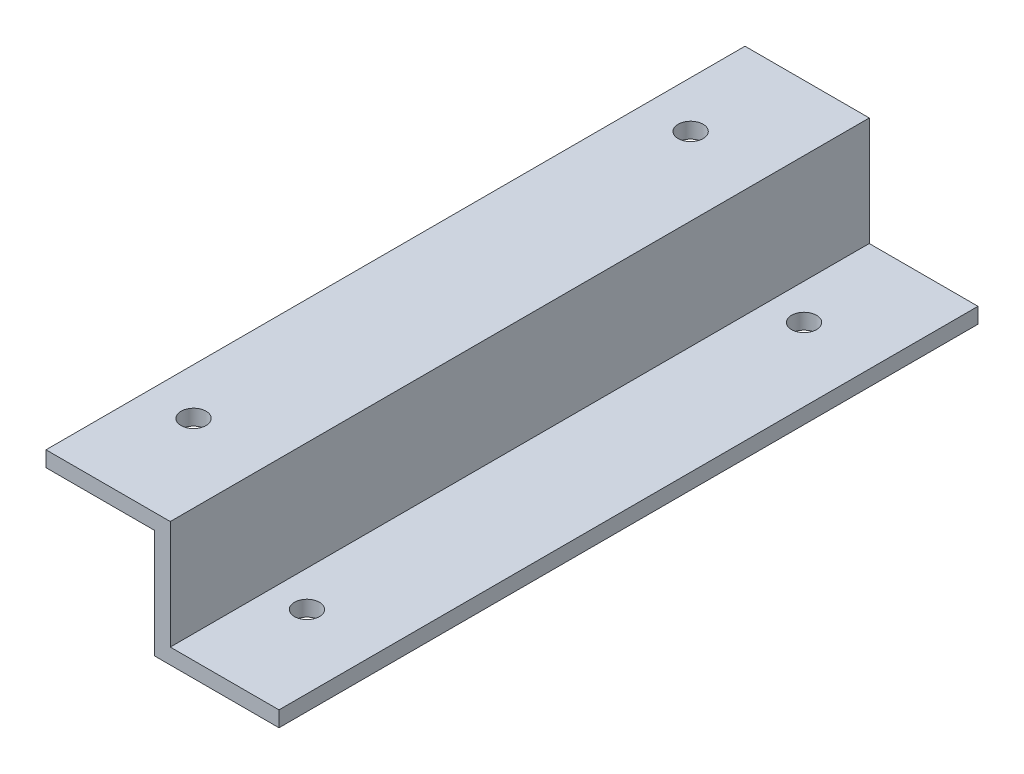
ISO-10303-21;
HEADER;
FILE_DESCRIPTION(('STEP AP214'),'2;1');
FILE_NAME('part.step','',(''),(''),'','','');
FILE_SCHEMA(('AUTOMOTIVE_DESIGN { 1 0 10303 214 1 1 1 1 }'));
ENDSEC;
DATA;
#1=APPLICATION_CONTEXT('core data for automotive mechanical design processes');
#2=APPLICATION_PROTOCOL_DEFINITION('international standard','automotive_design',2000,#1);
#3=PRODUCT_CONTEXT('',#1,'mechanical');
#4=PRODUCT('Part','Part','',(#3));
#5=PRODUCT_RELATED_PRODUCT_CATEGORY('part','',(#4));
#6=PRODUCT_DEFINITION_FORMATION('','',#4);
#7=PRODUCT_DEFINITION_CONTEXT('part definition',#1,'design');
#8=PRODUCT_DEFINITION('design','',#6,#7);
#9=PRODUCT_DEFINITION_SHAPE('','',#8);
#10=(LENGTH_UNIT() NAMED_UNIT(*) SI_UNIT(.MILLI.,.METRE.));
#11=(NAMED_UNIT(*) PLANE_ANGLE_UNIT() SI_UNIT($,.RADIAN.));
#12=(NAMED_UNIT(*) SI_UNIT($,.STERADIAN.) SOLID_ANGLE_UNIT());
#13=UNCERTAINTY_MEASURE_WITH_UNIT(LENGTH_MEASURE(1.E-05),#10,'distance_accuracy_value','');
#14=(GEOMETRIC_REPRESENTATION_CONTEXT(3) GLOBAL_UNCERTAINTY_ASSIGNED_CONTEXT((#13)) GLOBAL_UNIT_ASSIGNED_CONTEXT((#10,
#11,#12)) REPRESENTATION_CONTEXT('',''));
#15=CARTESIAN_POINT('',(0.,0.,0.));
#16=DIRECTION('',(0.,0.,1.));
#17=DIRECTION('',(1.,0.,0.));
#18=AXIS2_PLACEMENT_3D('',#15,#16,#17);
#19=CARTESIAN_POINT('',(1.5875,12.7,71.4375));
#20=DIRECTION('',(0.,-1.,0.));
#21=DIRECTION('',(0.,0.,-1.));
#22=AXIS2_PLACEMENT_3D('',#19,#20,#21);
#23=PLANE('',#22);
#24=CARTESIAN_POINT('',(-14.2875000000007,12.7,-50.7999994920001));
#25=DIRECTION('',(0.,1.,0.));
#26=DIRECTION('',(0.,0.,1.));
#27=AXIS2_PLACEMENT_3D('',#24,#25,#26);
#28=CIRCLE('',#27,2.55269999999999);
#29=CARTESIAN_POINT('',(-14.2875000000007,12.7,-48.2472994920001));
#30=VERTEX_POINT('',#29);
#31=EDGE_CURVE('E127',#30,#30,#28,.T.);
#32=ORIENTED_EDGE('',*,*,#31,.F.);
#33=EDGE_LOOP('',(#32));
#34=FACE_BOUND('',#33,.T.);
#35=DIRECTION('',(0.,0.,-1.));
#36=VECTOR('',#35,1.);
#37=CARTESIAN_POINT('',(1.5875,12.7,71.4375));
#38=LINE('',#37,#36);
#39=CARTESIAN_POINT('',(1.5875,12.7,71.4375));
#40=VERTEX_POINT('',#39);
#41=CARTESIAN_POINT('',(1.5875,12.7,-71.4375));
#42=VERTEX_POINT('',#41);
#43=EDGE_CURVE('E47',#40,#42,#38,.T.);
#44=ORIENTED_EDGE('',*,*,#43,.T.);
#45=DIRECTION('',(-1.,0.,0.));
#46=VECTOR('',#45,1.);
#47=CARTESIAN_POINT('',(1.5875,12.7,-71.4375));
#48=LINE('',#47,#46);
#49=CARTESIAN_POINT('',(-23.8125,12.7,-71.4375));
#50=VERTEX_POINT('',#49);
#51=EDGE_CURVE('E121',#42,#50,#48,.T.);
#52=ORIENTED_EDGE('',*,*,#51,.T.);
#53=DIRECTION('',(0.,0.,-1.));
#54=VECTOR('',#53,1.);
#55=CARTESIAN_POINT('',(-23.8125,12.7,71.4375));
#56=LINE('',#55,#54);
#57=CARTESIAN_POINT('',(-23.8125,12.7,71.4375));
#58=VERTEX_POINT('',#57);
#59=EDGE_CURVE('E168',#58,#50,#56,.T.);
#60=ORIENTED_EDGE('',*,*,#59,.F.);
#61=DIRECTION('',(-1.,0.,0.));
#62=VECTOR('',#61,1.);
#63=CARTESIAN_POINT('',(1.5875,12.7,71.4375));
#64=LINE('',#63,#62);
#65=EDGE_CURVE('E149',#40,#58,#64,.T.);
#66=ORIENTED_EDGE('',*,*,#65,.F.);
#67=EDGE_LOOP('',(#44,#52,#60,#66));
#68=FACE_BOUND('',#67,.T.);
#69=CARTESIAN_POINT('',(-14.2875000000007,12.7,50.8000005079999));
#70=DIRECTION('',(0.,1.,0.));
#71=DIRECTION('',(0.,0.,1.));
#72=AXIS2_PLACEMENT_3D('',#69,#70,#71);
#73=CIRCLE('',#72,2.55269999999999);
#74=CARTESIAN_POINT('',(-14.2875000000007,12.7,53.3527005079999));
#75=VERTEX_POINT('',#74);
#76=EDGE_CURVE('E268',#75,#75,#73,.T.);
#77=ORIENTED_EDGE('',*,*,#76,.F.);
#78=EDGE_LOOP('',(#77));
#79=FACE_BOUND('',#78,.T.);
#80=ADVANCED_FACE('F38',(#34,#68,#79),#23,.F.);
#81=CARTESIAN_POINT('',(1.5875,-9.525,71.4375));
#82=DIRECTION('',(0.,-1.,0.));
#83=DIRECTION('',(0.,0.,-1.));
#84=AXIS2_PLACEMENT_3D('',#81,#82,#83);
#85=PLANE('',#84);
#86=CARTESIAN_POINT('',(8.89000000000002,-9.525,50.8000005079999));
#87=DIRECTION('',(0.,1.,0.));
#88=DIRECTION('',(0.,0.,1.));
#89=AXIS2_PLACEMENT_3D('',#86,#87,#88);
#90=CIRCLE('',#89,2.55269999999999);
#91=CARTESIAN_POINT('',(8.89000000000002,-9.525,53.3527005079999));
#92=VERTEX_POINT('',#91);
#93=EDGE_CURVE('E259',#92,#92,#90,.T.);
#94=ORIENTED_EDGE('',*,*,#93,.F.);
#95=EDGE_LOOP('',(#94));
#96=FACE_BOUND('',#95,.T.);
#97=CARTESIAN_POINT('',(8.89000000000002,-9.525,-50.7997000062309));
#98=DIRECTION('',(0.,1.,0.));
#99=DIRECTION('',(0.,0.,1.));
#100=AXIS2_PLACEMENT_3D('',#97,#98,#99);
#101=CIRCLE('',#100,2.55269999999999);
#102=CARTESIAN_POINT('',(8.89000000000002,-9.525,-48.2470000062309));
#103=VERTEX_POINT('',#102);
#104=EDGE_CURVE('E261',#103,#103,#101,.T.);
#105=ORIENTED_EDGE('',*,*,#104,.F.);
#106=EDGE_LOOP('',(#105));
#107=FACE_BOUND('',#106,.T.);
#108=DIRECTION('',(0.,0.,-1.));
#109=VECTOR('',#108,1.);
#110=CARTESIAN_POINT('',(23.8125,-9.525,71.4375));
#111=LINE('',#110,#109);
#112=CARTESIAN_POINT('',(23.8125,-9.525,71.4375));
#113=VERTEX_POINT('',#112);
#114=CARTESIAN_POINT('',(23.8125,-9.525,-71.4375));
#115=VERTEX_POINT('',#114);
#116=EDGE_CURVE('E123',#113,#115,#111,.T.);
#117=ORIENTED_EDGE('',*,*,#116,.T.);
#118=DIRECTION('',(-1.,0.,0.));
#119=VECTOR('',#118,1.);
#120=CARTESIAN_POINT('',(1.5875,-9.525,-71.4375));
#121=LINE('',#120,#119);
#122=CARTESIAN_POINT('',(1.5875,-9.525,-71.4375));
#123=VERTEX_POINT('',#122);
#124=EDGE_CURVE('E117',#115,#123,#121,.T.);
#125=ORIENTED_EDGE('',*,*,#124,.T.);
#126=DIRECTION('',(0.,0.,-1.));
#127=VECTOR('',#126,1.);
#128=CARTESIAN_POINT('',(1.5875,-9.525,71.4375));
#129=LINE('',#128,#127);
#130=CARTESIAN_POINT('',(1.5875,-9.525,71.4375));
#131=VERTEX_POINT('',#130);
#132=EDGE_CURVE('E11',#131,#123,#129,.T.);
#133=ORIENTED_EDGE('',*,*,#132,.F.);
#134=DIRECTION('',(-1.,0.,0.));
#135=VECTOR('',#134,1.);
#136=CARTESIAN_POINT('',(1.5875,-9.525,71.4375));
#137=LINE('',#136,#135);
#138=EDGE_CURVE('E146',#113,#131,#137,.T.);
#139=ORIENTED_EDGE('',*,*,#138,.F.);
#140=EDGE_LOOP('',(#117,#125,#133,#139));
#141=FACE_BOUND('',#140,.T.);
#142=ADVANCED_FACE('F40',(#96,#107,#141),#85,.F.);
#143=CARTESIAN_POINT('',(1.5875,-9.525,71.4375));
#144=DIRECTION('',(-1.,0.,0.));
#145=DIRECTION('',(0.,0.,1.));
#146=AXIS2_PLACEMENT_3D('',#143,#144,#145);
#147=PLANE('',#146);
#148=ORIENTED_EDGE('',*,*,#132,.T.);
#149=DIRECTION('',(0.,1.,0.));
#150=VECTOR('',#149,1.);
#151=CARTESIAN_POINT('',(1.5875,-9.525,-71.4375));
#152=LINE('',#151,#150);
#153=EDGE_CURVE('E107',#123,#42,#152,.T.);
#154=ORIENTED_EDGE('',*,*,#153,.T.);
#155=ORIENTED_EDGE('',*,*,#43,.F.);
#156=DIRECTION('',(0.,1.,0.));
#157=VECTOR('',#156,1.);
#158=CARTESIAN_POINT('',(1.5875,-9.525,71.4375));
#159=LINE('',#158,#157);
#160=EDGE_CURVE('E108',#131,#40,#159,.T.);
#161=ORIENTED_EDGE('',*,*,#160,.F.);
#162=EDGE_LOOP('',(#148,#154,#155,#161));
#163=FACE_BOUND('',#162,.T.);
#164=ADVANCED_FACE('F105',(#163),#147,.F.);
#165=CARTESIAN_POINT('',(-23.8125,12.7,71.4375));
#166=DIRECTION('',(1.,0.,0.));
#167=DIRECTION('',(0.,0.,-1.));
#168=AXIS2_PLACEMENT_3D('',#165,#166,#167);
#169=PLANE('',#168);
#170=ORIENTED_EDGE('',*,*,#59,.T.);
#171=DIRECTION('',(0.,-1.,0.));
#172=VECTOR('',#171,1.);
#173=CARTESIAN_POINT('',(-23.8125,12.7,-71.4375));
#174=LINE('',#173,#172);
#175=CARTESIAN_POINT('',(-23.8125,9.525,-71.4375));
#176=VERTEX_POINT('',#175);
#177=EDGE_CURVE('E132',#50,#176,#174,.T.);
#178=ORIENTED_EDGE('',*,*,#177,.T.);
#179=DIRECTION('',(0.,0.,-1.));
#180=VECTOR('',#179,1.);
#181=CARTESIAN_POINT('',(-23.8125,9.525,71.4375));
#182=LINE('',#181,#180);
#183=CARTESIAN_POINT('',(-23.8125,9.525,71.4375));
#184=VERTEX_POINT('',#183);
#185=EDGE_CURVE('E166',#184,#176,#182,.T.);
#186=ORIENTED_EDGE('',*,*,#185,.F.);
#187=DIRECTION('',(0.,-1.,0.));
#188=VECTOR('',#187,1.);
#189=CARTESIAN_POINT('',(-23.8125,12.7,71.4375));
#190=LINE('',#189,#188);
#191=EDGE_CURVE('E151',#58,#184,#190,.T.);
#192=ORIENTED_EDGE('',*,*,#191,.F.);
#193=EDGE_LOOP('',(#170,#178,#186,#192));
#194=FACE_BOUND('',#193,.T.);
#195=ADVANCED_FACE('F180',(#194),#169,.F.);
#196=CARTESIAN_POINT('',(-1.5875,9.525,71.4375));
#197=DIRECTION('',(0.,1.,0.));
#198=DIRECTION('',(0.,0.,1.));
#199=AXIS2_PLACEMENT_3D('',#196,#197,#198);
#200=PLANE('',#199);
#201=CARTESIAN_POINT('',(-14.2875000000007,9.525,50.8000005079999));
#202=DIRECTION('',(0.,1.,0.));
#203=DIRECTION('',(0.,0.,1.));
#204=AXIS2_PLACEMENT_3D('',#201,#202,#203);
#205=CIRCLE('',#204,2.55269999999999);
#206=CARTESIAN_POINT('',(-14.2875000000007,9.525,53.3527005079999));
#207=VERTEX_POINT('',#206);
#208=EDGE_CURVE('E42',#207,#207,#205,.T.);
#209=ORIENTED_EDGE('',*,*,#208,.T.);
#210=EDGE_LOOP('',(#209));
#211=FACE_BOUND('',#210,.T.);
#212=CARTESIAN_POINT('',(-14.2875000000007,9.525,-50.7999994920001));
#213=DIRECTION('',(0.,1.,0.));
#214=DIRECTION('',(0.,0.,1.));
#215=AXIS2_PLACEMENT_3D('',#212,#213,#214);
#216=CIRCLE('',#215,2.55269999999999);
#217=CARTESIAN_POINT('',(-14.2875000000007,9.525,-48.2472994920001));
#218=VERTEX_POINT('',#217);
#219=EDGE_CURVE('E124',#218,#218,#216,.T.);
#220=ORIENTED_EDGE('',*,*,#219,.T.);
#221=EDGE_LOOP('',(#220));
#222=FACE_BOUND('',#221,.T.);
#223=ORIENTED_EDGE('',*,*,#185,.T.);
#224=DIRECTION('',(1.,0.,0.));
#225=VECTOR('',#224,1.);
#226=CARTESIAN_POINT('',(-1.5875,9.525,-71.4375));
#227=LINE('',#226,#225);
#228=CARTESIAN_POINT('',(-1.5875,9.525,-71.4375));
#229=VERTEX_POINT('',#228);
#230=EDGE_CURVE('E135',#176,#229,#227,.T.);
#231=ORIENTED_EDGE('',*,*,#230,.T.);
#232=DIRECTION('',(0.,0.,-1.));
#233=VECTOR('',#232,1.);
#234=CARTESIAN_POINT('',(-1.5875,9.525,71.4375));
#235=LINE('',#234,#233);
#236=CARTESIAN_POINT('',(-1.5875,9.525,71.4375));
#237=VERTEX_POINT('',#236);
#238=EDGE_CURVE('E164',#237,#229,#235,.T.);
#239=ORIENTED_EDGE('',*,*,#238,.F.);
#240=DIRECTION('',(1.,0.,0.));
#241=VECTOR('',#240,1.);
#242=CARTESIAN_POINT('',(-1.5875,9.525,71.4375));
#243=LINE('',#242,#241);
#244=EDGE_CURVE('E153',#184,#237,#243,.T.);
#245=ORIENTED_EDGE('',*,*,#244,.F.);
#246=EDGE_LOOP('',(#223,#231,#239,#245));
#247=FACE_BOUND('',#246,.T.);
#248=ADVANCED_FACE('F183',(#211,#222,#247),#200,.F.);
#249=CARTESIAN_POINT('',(-1.5875,-12.7,71.4375));
#250=DIRECTION('',(1.,0.,0.));
#251=DIRECTION('',(0.,0.,-1.));
#252=AXIS2_PLACEMENT_3D('',#249,#250,#251);
#253=PLANE('',#252);
#254=ORIENTED_EDGE('',*,*,#238,.T.);
#255=DIRECTION('',(0.,-1.,0.));
#256=VECTOR('',#255,1.);
#257=CARTESIAN_POINT('',(-1.5875,-12.7,-71.4375));
#258=LINE('',#257,#256);
#259=CARTESIAN_POINT('',(-1.5875,-12.7,-71.4375));
#260=VERTEX_POINT('',#259);
#261=EDGE_CURVE('E138',#229,#260,#258,.T.);
#262=ORIENTED_EDGE('',*,*,#261,.T.);
#263=DIRECTION('',(0.,0.,-1.));
#264=VECTOR('',#263,1.);
#265=CARTESIAN_POINT('',(-1.5875,-12.7,71.4375));
#266=LINE('',#265,#264);
#267=CARTESIAN_POINT('',(-1.5875,-12.7,71.4375));
#268=VERTEX_POINT('',#267);
#269=EDGE_CURVE('E162',#268,#260,#266,.T.);
#270=ORIENTED_EDGE('',*,*,#269,.F.);
#271=DIRECTION('',(0.,-1.,0.));
#272=VECTOR('',#271,1.);
#273=CARTESIAN_POINT('',(-1.5875,-12.7,71.4375));
#274=LINE('',#273,#272);
#275=EDGE_CURVE('E155',#237,#268,#274,.T.);
#276=ORIENTED_EDGE('',*,*,#275,.F.);
#277=EDGE_LOOP('',(#254,#262,#270,#276));
#278=FACE_BOUND('',#277,.T.);
#279=ADVANCED_FACE('F188',(#278),#253,.F.);
#280=CARTESIAN_POINT('',(-1.5875,-12.7,71.4375));
#281=DIRECTION('',(0.,1.,0.));
#282=DIRECTION('',(0.,0.,1.));
#283=AXIS2_PLACEMENT_3D('',#280,#281,#282);
#284=PLANE('',#283);
#285=CARTESIAN_POINT('',(8.89000000000002,-12.7,50.8000005079999));
#286=DIRECTION('',(0.,1.,0.));
#287=DIRECTION('',(0.,0.,1.));
#288=AXIS2_PLACEMENT_3D('',#285,#286,#287);
#289=CIRCLE('',#288,2.5527);
#290=CARTESIAN_POINT('',(8.89000000000002,-12.7,53.3527005079999));
#291=VERTEX_POINT('',#290);
#292=EDGE_CURVE('E256',#291,#291,#289,.T.);
#293=ORIENTED_EDGE('',*,*,#292,.T.);
#294=EDGE_LOOP('',(#293));
#295=FACE_BOUND('',#294,.T.);
#296=CARTESIAN_POINT('',(8.89000000000002,-12.7,-50.7997000062309));
#297=DIRECTION('',(0.,1.,0.));
#298=DIRECTION('',(0.,0.,1.));
#299=AXIS2_PLACEMENT_3D('',#296,#297,#298);
#300=CIRCLE('',#299,2.5527);
#301=CARTESIAN_POINT('',(8.89000000000002,-12.7,-48.2470000062309));
#302=VERTEX_POINT('',#301);
#303=EDGE_CURVE('E266',#302,#302,#300,.T.);
#304=ORIENTED_EDGE('',*,*,#303,.T.);
#305=EDGE_LOOP('',(#304));
#306=FACE_BOUND('',#305,.T.);
#307=ORIENTED_EDGE('',*,*,#269,.T.);
#308=DIRECTION('',(1.,0.,0.));
#309=VECTOR('',#308,1.);
#310=CARTESIAN_POINT('',(-1.5875,-12.7,-71.4375));
#311=LINE('',#310,#309);
#312=CARTESIAN_POINT('',(23.8125,-12.7,-71.4375));
#313=VERTEX_POINT('',#312);
#314=EDGE_CURVE('E141',#260,#313,#311,.T.);
#315=ORIENTED_EDGE('',*,*,#314,.T.);
#316=DIRECTION('',(0.,0.,-1.));
#317=VECTOR('',#316,1.);
#318=CARTESIAN_POINT('',(23.8125,-12.7,71.4375));
#319=LINE('',#318,#317);
#320=CARTESIAN_POINT('',(23.8125,-12.7,71.4375));
#321=VERTEX_POINT('',#320);
#322=EDGE_CURVE('E160',#321,#313,#319,.T.);
#323=ORIENTED_EDGE('',*,*,#322,.F.);
#324=DIRECTION('',(1.,0.,0.));
#325=VECTOR('',#324,1.);
#326=CARTESIAN_POINT('',(-1.5875,-12.7,71.4375));
#327=LINE('',#326,#325);
#328=EDGE_CURVE('E60',#268,#321,#327,.T.);
#329=ORIENTED_EDGE('',*,*,#328,.F.);
#330=EDGE_LOOP('',(#307,#315,#323,#329));
#331=FACE_BOUND('',#330,.T.);
#332=ADVANCED_FACE('F191',(#295,#306,#331),#284,.F.);
#333=CARTESIAN_POINT('',(23.8125,-9.525,71.4375));
#334=DIRECTION('',(-1.,0.,0.));
#335=DIRECTION('',(0.,0.,1.));
#336=AXIS2_PLACEMENT_3D('',#333,#334,#335);
#337=PLANE('',#336);
#338=ORIENTED_EDGE('',*,*,#322,.T.);
#339=DIRECTION('',(0.,1.,0.));
#340=VECTOR('',#339,1.);
#341=CARTESIAN_POINT('',(23.8125,-9.525,-71.4375));
#342=LINE('',#341,#340);
#343=EDGE_CURVE('E144',#313,#115,#342,.T.);
#344=ORIENTED_EDGE('',*,*,#343,.T.);
#345=ORIENTED_EDGE('',*,*,#116,.F.);
#346=DIRECTION('',(0.,1.,0.));
#347=VECTOR('',#346,1.);
#348=CARTESIAN_POINT('',(23.8125,-9.525,71.4375));
#349=LINE('',#348,#347);
#350=EDGE_CURVE('E55',#321,#113,#349,.T.);
#351=ORIENTED_EDGE('',*,*,#350,.F.);
#352=EDGE_LOOP('',(#338,#344,#345,#351));
#353=FACE_BOUND('',#352,.T.);
#354=ADVANCED_FACE('F193',(#353),#337,.F.);
#355=CARTESIAN_POINT('',(0.,0.,71.4375));
#356=DIRECTION('',(0.,0.,-1.));
#357=DIRECTION('',(-1.,0.,0.));
#358=AXIS2_PLACEMENT_3D('',#355,#356,#357);
#359=PLANE('',#358);
#360=ORIENTED_EDGE('',*,*,#138,.T.);
#361=ORIENTED_EDGE('',*,*,#160,.T.);
#362=ORIENTED_EDGE('',*,*,#65,.T.);
#363=ORIENTED_EDGE('',*,*,#191,.T.);
#364=ORIENTED_EDGE('',*,*,#244,.T.);
#365=ORIENTED_EDGE('',*,*,#275,.T.);
#366=ORIENTED_EDGE('',*,*,#328,.T.);
#367=ORIENTED_EDGE('',*,*,#350,.T.);
#368=EDGE_LOOP('',(#360,#361,#362,#363,#364,#365,#366,#367));
#369=FACE_BOUND('',#368,.T.);
#370=ADVANCED_FACE('F175',(#369),#359,.F.);
#371=CARTESIAN_POINT('',(0.,0.,-71.4375));
#372=DIRECTION('',(0.,0.,-1.));
#373=DIRECTION('',(-1.,0.,0.));
#374=AXIS2_PLACEMENT_3D('',#371,#372,#373);
#375=PLANE('',#374);
#376=ORIENTED_EDGE('',*,*,#124,.F.);
#377=ORIENTED_EDGE('',*,*,#343,.F.);
#378=ORIENTED_EDGE('',*,*,#314,.F.);
#379=ORIENTED_EDGE('',*,*,#261,.F.);
#380=ORIENTED_EDGE('',*,*,#230,.F.);
#381=ORIENTED_EDGE('',*,*,#177,.F.);
#382=ORIENTED_EDGE('',*,*,#51,.F.);
#383=ORIENTED_EDGE('',*,*,#153,.F.);
#384=EDGE_LOOP('',(#376,#377,#378,#379,#380,#381,#382,#383));
#385=FACE_BOUND('',#384,.T.);
#386=ADVANCED_FACE('F115',(#385),#375,.T.);
#387=CARTESIAN_POINT('',(-14.2875000000007,12.7,-50.7999994920001));
#388=DIRECTION('',(0.,1.,0.));
#389=DIRECTION('',(0.,0.,1.));
#390=AXIS2_PLACEMENT_3D('',#387,#388,#389);
#391=CYLINDRICAL_SURFACE('',#390,2.55269999999999);
#392=ORIENTED_EDGE('',*,*,#31,.T.);
#393=EDGE_LOOP('',(#392));
#394=FACE_BOUND('',#393,.T.);
#395=ORIENTED_EDGE('',*,*,#219,.F.);
#396=EDGE_LOOP('',(#395));
#397=FACE_BOUND('',#396,.T.);
#398=ADVANCED_FACE('F230',(#394,#397),#391,.F.);
#399=CARTESIAN_POINT('',(-14.2875000000007,12.7,50.8000005079999));
#400=DIRECTION('',(0.,1.,0.));
#401=DIRECTION('',(0.,0.,1.));
#402=AXIS2_PLACEMENT_3D('',#399,#400,#401);
#403=CYLINDRICAL_SURFACE('',#402,2.55269999999999);
#404=ORIENTED_EDGE('',*,*,#76,.T.);
#405=EDGE_LOOP('',(#404));
#406=FACE_BOUND('',#405,.T.);
#407=ORIENTED_EDGE('',*,*,#208,.F.);
#408=EDGE_LOOP('',(#407));
#409=FACE_BOUND('',#408,.T.);
#410=ADVANCED_FACE('F232',(#406,#409),#403,.F.);
#411=CARTESIAN_POINT('',(8.89000000000002,-9.525,-50.7997000062309));
#412=DIRECTION('',(0.,1.,0.));
#413=DIRECTION('',(0.,0.,1.));
#414=AXIS2_PLACEMENT_3D('',#411,#412,#413);
#415=CYLINDRICAL_SURFACE('',#414,2.55269999999999);
#416=ORIENTED_EDGE('',*,*,#303,.F.);
#417=EDGE_LOOP('',(#416));
#418=FACE_BOUND('',#417,.T.);
#419=ORIENTED_EDGE('',*,*,#104,.T.);
#420=EDGE_LOOP('',(#419));
#421=FACE_BOUND('',#420,.T.);
#422=ADVANCED_FACE('F239',(#418,#421),#415,.F.);
#423=CARTESIAN_POINT('',(8.89000000000002,-9.525,50.8000005079999));
#424=DIRECTION('',(0.,1.,0.));
#425=DIRECTION('',(0.,0.,1.));
#426=AXIS2_PLACEMENT_3D('',#423,#424,#425);
#427=CYLINDRICAL_SURFACE('',#426,2.55269999999999);
#428=ORIENTED_EDGE('',*,*,#292,.F.);
#429=EDGE_LOOP('',(#428));
#430=FACE_BOUND('',#429,.T.);
#431=ORIENTED_EDGE('',*,*,#93,.T.);
#432=EDGE_LOOP('',(#431));
#433=FACE_BOUND('',#432,.T.);
#434=ADVANCED_FACE('F247',(#430,#433),#427,.F.);
#435=CLOSED_SHELL('',(#80,#142,#164,#195,#248,#279,#332,#354,#370,#386,#398,#410,#422,#434));
#436=MANIFOLD_SOLID_BREP('B2',#435);
#437=ADVANCED_BREP_SHAPE_REPRESENTATION('',(#18,#436),#14);
#438=SHAPE_DEFINITION_REPRESENTATION(#9,#437);
ENDSEC;
END-ISO-10303-21;
